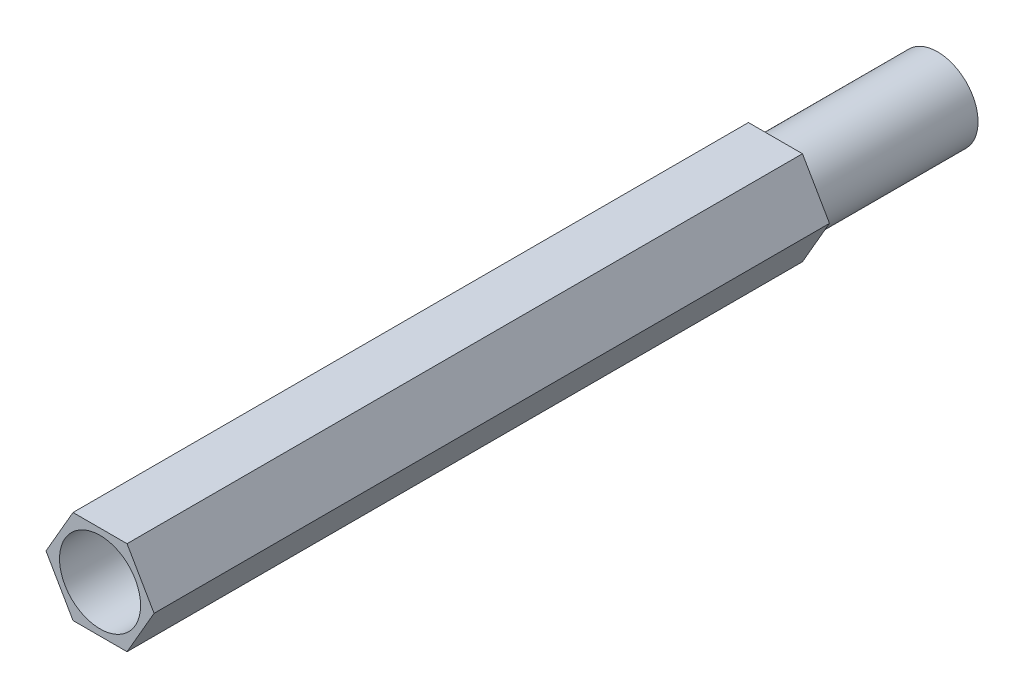
ISO-10303-21;
HEADER;
FILE_DESCRIPTION(('STEP AP214'),'2;1');
FILE_NAME('part.step','',(''),(''),'','','');
FILE_SCHEMA(('AUTOMOTIVE_DESIGN { 1 0 10303 214 1 1 1 1 }'));
ENDSEC;
DATA;
#1=APPLICATION_CONTEXT('core data for automotive mechanical design processes');
#2=APPLICATION_PROTOCOL_DEFINITION('international standard','automotive_design',2000,#1);
#3=PRODUCT_CONTEXT('',#1,'mechanical');
#4=PRODUCT('Part','Part','',(#3));
#5=PRODUCT_RELATED_PRODUCT_CATEGORY('part','',(#4));
#6=PRODUCT_DEFINITION_FORMATION('','',#4);
#7=PRODUCT_DEFINITION_CONTEXT('part definition',#1,'design');
#8=PRODUCT_DEFINITION('design','',#6,#7);
#9=PRODUCT_DEFINITION_SHAPE('','',#8);
#10=(LENGTH_UNIT() NAMED_UNIT(*) SI_UNIT(.MILLI.,.METRE.));
#11=(NAMED_UNIT(*) PLANE_ANGLE_UNIT() SI_UNIT($,.RADIAN.));
#12=(NAMED_UNIT(*) SI_UNIT($,.STERADIAN.) SOLID_ANGLE_UNIT());
#13=UNCERTAINTY_MEASURE_WITH_UNIT(LENGTH_MEASURE(1.E-05),#10,'distance_accuracy_value','');
#14=(GEOMETRIC_REPRESENTATION_CONTEXT(3) GLOBAL_UNCERTAINTY_ASSIGNED_CONTEXT((#13)) GLOBAL_UNIT_ASSIGNED_CONTEXT((#10,
#11,#12)) REPRESENTATION_CONTEXT('',''));
#15=CARTESIAN_POINT('',(0.,0.,0.));
#16=DIRECTION('',(0.,0.,1.));
#17=DIRECTION('',(1.,0.,0.));
#18=AXIS2_PLACEMENT_3D('',#15,#16,#17);
#19=CARTESIAN_POINT('',(0.999999999999947,-1.73205080756897,25.));
#20=DIRECTION('',(0.,-1.,0.));
#21=DIRECTION('',(0.,0.,-1.));
#22=AXIS2_PLACEMENT_3D('',#19,#20,#21);
#23=PLANE('',#22);
#24=DIRECTION('',(-1.,0.,0.));
#25=VECTOR('',#24,1.);
#26=CARTESIAN_POINT('',(0.999999999999947,-1.73205080756897,0.));
#27=LINE('',#26,#25);
#28=CARTESIAN_POINT('',(0.999999999999947,-1.73205080756897,0.));
#29=VERTEX_POINT('',#28);
#30=CARTESIAN_POINT('',(-1.00000000000005,-1.73205080756897,0.));
#31=VERTEX_POINT('',#30);
#32=EDGE_CURVE('E128',#29,#31,#27,.T.);
#33=ORIENTED_EDGE('',*,*,#32,.F.);
#34=DIRECTION('',(0.,0.,-1.));
#35=VECTOR('',#34,1.);
#36=CARTESIAN_POINT('',(0.999999999999947,-1.73205080756897,25.));
#37=LINE('',#36,#35);
#38=CARTESIAN_POINT('',(0.999999999999947,-1.73205080756897,25.));
#39=VERTEX_POINT('',#38);
#40=EDGE_CURVE('E50',#39,#29,#37,.T.);
#41=ORIENTED_EDGE('',*,*,#40,.F.);
#42=DIRECTION('',(-1.,0.,0.));
#43=VECTOR('',#42,1.);
#44=CARTESIAN_POINT('',(0.999999999999947,-1.73205080756897,25.));
#45=LINE('',#44,#43);
#46=CARTESIAN_POINT('',(-1.00000000000005,-1.73205080756897,25.));
#47=VERTEX_POINT('',#46);
#48=EDGE_CURVE('E144',#39,#47,#45,.T.);
#49=ORIENTED_EDGE('',*,*,#48,.T.);
#50=DIRECTION('',(0.,0.,-1.));
#51=VECTOR('',#50,1.);
#52=CARTESIAN_POINT('',(-1.00000000000005,-1.73205080756897,25.));
#53=LINE('',#52,#51);
#54=EDGE_CURVE('E44',#47,#31,#53,.T.);
#55=ORIENTED_EDGE('',*,*,#54,.T.);
#56=EDGE_LOOP('',(#33,#41,#49,#55));
#57=FACE_BOUND('',#56,.T.);
#58=ADVANCED_FACE('F41',(#57),#23,.T.);
#59=CARTESIAN_POINT('',(2.,0.,25.));
#60=DIRECTION('',(0.866025403784439,-0.5,0.));
#61=DIRECTION('',(0.5,0.866025403784439,0.));
#62=AXIS2_PLACEMENT_3D('',#59,#60,#61);
#63=PLANE('',#62);
#64=DIRECTION('',(-0.5,-0.866025403784439,0.));
#65=VECTOR('',#64,1.);
#66=CARTESIAN_POINT('',(2.,0.,0.));
#67=LINE('',#66,#65);
#68=CARTESIAN_POINT('',(2.,0.,0.));
#69=VERTEX_POINT('',#68);
#70=EDGE_CURVE('E141',#69,#29,#67,.T.);
#71=ORIENTED_EDGE('',*,*,#70,.F.);
#72=DIRECTION('',(0.,0.,-1.));
#73=VECTOR('',#72,1.);
#74=CARTESIAN_POINT('',(2.,0.,25.));
#75=LINE('',#74,#73);
#76=CARTESIAN_POINT('',(2.,0.,25.));
#77=VERTEX_POINT('',#76);
#78=EDGE_CURVE('E81',#77,#69,#75,.T.);
#79=ORIENTED_EDGE('',*,*,#78,.F.);
#80=DIRECTION('',(-0.5,-0.866025403784439,0.));
#81=VECTOR('',#80,1.);
#82=CARTESIAN_POINT('',(2.,0.,25.));
#83=LINE('',#82,#81);
#84=EDGE_CURVE('E118',#77,#39,#83,.T.);
#85=ORIENTED_EDGE('',*,*,#84,.T.);
#86=ORIENTED_EDGE('',*,*,#40,.T.);
#87=EDGE_LOOP('',(#71,#79,#85,#86));
#88=FACE_BOUND('',#87,.T.);
#89=ADVANCED_FACE('F152',(#88),#63,.T.);
#90=CARTESIAN_POINT('',(0.999999999999947,1.73205080756897,25.));
#91=DIRECTION('',(0.866025403784439,0.5,0.));
#92=DIRECTION('',(-0.5,0.866025403784439,0.));
#93=AXIS2_PLACEMENT_3D('',#90,#91,#92);
#94=PLANE('',#93);
#95=DIRECTION('',(0.5,-0.866025403784439,0.));
#96=VECTOR('',#95,1.);
#97=CARTESIAN_POINT('',(0.999999999999947,1.73205080756897,0.));
#98=LINE('',#97,#96);
#99=CARTESIAN_POINT('',(0.999999999999947,1.73205080756897,0.));
#100=VERTEX_POINT('',#99);
#101=EDGE_CURVE('E105',#100,#69,#98,.T.);
#102=ORIENTED_EDGE('',*,*,#101,.F.);
#103=DIRECTION('',(0.,0.,-1.));
#104=VECTOR('',#103,1.);
#105=CARTESIAN_POINT('',(0.999999999999947,1.73205080756897,25.));
#106=LINE('',#105,#104);
#107=CARTESIAN_POINT('',(0.999999999999947,1.73205080756897,25.));
#108=VERTEX_POINT('',#107);
#109=EDGE_CURVE('E100',#108,#100,#106,.T.);
#110=ORIENTED_EDGE('',*,*,#109,.F.);
#111=DIRECTION('',(0.5,-0.866025403784439,0.));
#112=VECTOR('',#111,1.);
#113=CARTESIAN_POINT('',(0.999999999999947,1.73205080756897,25.));
#114=LINE('',#113,#112);
#115=EDGE_CURVE('E103',#108,#77,#114,.T.);
#116=ORIENTED_EDGE('',*,*,#115,.T.);
#117=ORIENTED_EDGE('',*,*,#78,.T.);
#118=EDGE_LOOP('',(#102,#110,#116,#117));
#119=FACE_BOUND('',#118,.T.);
#120=ADVANCED_FACE('F102',(#119),#94,.T.);
#121=CARTESIAN_POINT('',(-1.00000000000005,1.73205080756897,25.));
#122=DIRECTION('',(0.,1.,0.));
#123=DIRECTION('',(0.,0.,1.));
#124=AXIS2_PLACEMENT_3D('',#121,#122,#123);
#125=PLANE('',#124);
#126=DIRECTION('',(1.,0.,0.));
#127=VECTOR('',#126,1.);
#128=CARTESIAN_POINT('',(-1.00000000000005,1.73205080756897,0.));
#129=LINE('',#128,#127);
#130=CARTESIAN_POINT('',(-1.00000000000005,1.73205080756897,0.));
#131=VERTEX_POINT('',#130);
#132=EDGE_CURVE('E138',#131,#100,#129,.T.);
#133=ORIENTED_EDGE('',*,*,#132,.F.);
#134=DIRECTION('',(0.,0.,-1.));
#135=VECTOR('',#134,1.);
#136=CARTESIAN_POINT('',(-1.00000000000005,1.73205080756897,25.));
#137=LINE('',#136,#135);
#138=CARTESIAN_POINT('',(-1.00000000000005,1.73205080756897,25.));
#139=VERTEX_POINT('',#138);
#140=EDGE_CURVE('E110',#139,#131,#137,.T.);
#141=ORIENTED_EDGE('',*,*,#140,.F.);
#142=DIRECTION('',(1.,0.,0.));
#143=VECTOR('',#142,1.);
#144=CARTESIAN_POINT('',(-1.00000000000005,1.73205080756897,25.));
#145=LINE('',#144,#143);
#146=EDGE_CURVE('E116',#139,#108,#145,.T.);
#147=ORIENTED_EDGE('',*,*,#146,.T.);
#148=ORIENTED_EDGE('',*,*,#109,.T.);
#149=EDGE_LOOP('',(#133,#141,#147,#148));
#150=FACE_BOUND('',#149,.T.);
#151=ADVANCED_FACE('F120',(#150),#125,.T.);
#152=CARTESIAN_POINT('',(-2.00000000000011,0.,25.));
#153=DIRECTION('',(-0.866025403784439,0.5,0.));
#154=DIRECTION('',(-0.5,-0.866025403784439,0.));
#155=AXIS2_PLACEMENT_3D('',#152,#153,#154);
#156=PLANE('',#155);
#157=DIRECTION('',(0.5,0.866025403784439,0.));
#158=VECTOR('',#157,1.);
#159=CARTESIAN_POINT('',(-2.00000000000011,0.,0.));
#160=LINE('',#159,#158);
#161=CARTESIAN_POINT('',(-2.00000000000011,0.,0.));
#162=VERTEX_POINT('',#161);
#163=EDGE_CURVE('E135',#162,#131,#160,.T.);
#164=ORIENTED_EDGE('',*,*,#163,.F.);
#165=DIRECTION('',(0.,0.,-1.));
#166=VECTOR('',#165,1.);
#167=CARTESIAN_POINT('',(-2.00000000000011,0.,25.));
#168=LINE('',#167,#166);
#169=CARTESIAN_POINT('',(-2.00000000000011,0.,25.));
#170=VERTEX_POINT('',#169);
#171=EDGE_CURVE('E147',#170,#162,#168,.T.);
#172=ORIENTED_EDGE('',*,*,#171,.F.);
#173=DIRECTION('',(0.5,0.866025403784439,0.));
#174=VECTOR('',#173,1.);
#175=CARTESIAN_POINT('',(-2.00000000000011,0.,25.));
#176=LINE('',#175,#174);
#177=EDGE_CURVE('E121',#170,#139,#176,.T.);
#178=ORIENTED_EDGE('',*,*,#177,.T.);
#179=ORIENTED_EDGE('',*,*,#140,.T.);
#180=EDGE_LOOP('',(#164,#172,#178,#179));
#181=FACE_BOUND('',#180,.T.);
#182=ADVANCED_FACE('F165',(#181),#156,.T.);
#183=CARTESIAN_POINT('',(-1.00000000000005,-1.73205080756897,25.));
#184=DIRECTION('',(-0.866025403784439,-0.5,0.));
#185=DIRECTION('',(0.5,-0.866025403784439,0.));
#186=AXIS2_PLACEMENT_3D('',#183,#184,#185);
#187=PLANE('',#186);
#188=DIRECTION('',(-0.5,0.866025403784439,0.));
#189=VECTOR('',#188,1.);
#190=CARTESIAN_POINT('',(-1.00000000000005,-1.73205080756897,0.));
#191=LINE('',#190,#189);
#192=EDGE_CURVE('E131',#31,#162,#191,.T.);
#193=ORIENTED_EDGE('',*,*,#192,.F.);
#194=ORIENTED_EDGE('',*,*,#54,.F.);
#195=DIRECTION('',(-0.5,0.866025403784439,0.));
#196=VECTOR('',#195,1.);
#197=CARTESIAN_POINT('',(-1.00000000000005,-1.73205080756897,25.));
#198=LINE('',#197,#196);
#199=EDGE_CURVE('E123',#47,#170,#198,.T.);
#200=ORIENTED_EDGE('',*,*,#199,.T.);
#201=ORIENTED_EDGE('',*,*,#171,.T.);
#202=EDGE_LOOP('',(#193,#194,#200,#201));
#203=FACE_BOUND('',#202,.T.);
#204=ADVANCED_FACE('F149',(#203),#187,.T.);
#205=CARTESIAN_POINT('',(0.,0.,25.));
#206=DIRECTION('',(0.,0.,-1.));
#207=DIRECTION('',(-1.,0.,0.));
#208=AXIS2_PLACEMENT_3D('',#205,#206,#207);
#209=PLANE('',#208);
#210=CARTESIAN_POINT('',(0.,0.,25.));
#211=DIRECTION('',(0.,0.,1.));
#212=DIRECTION('',(1.,0.,0.));
#213=AXIS2_PLACEMENT_3D('',#210,#211,#212);
#214=CIRCLE('',#213,1.49999999999999);
#215=CARTESIAN_POINT('',(1.49999999999999,0.,25.));
#216=VERTEX_POINT('',#215);
#217=EDGE_CURVE('E201',#216,#216,#214,.T.);
#218=ORIENTED_EDGE('',*,*,#217,.F.);
#219=EDGE_LOOP('',(#218));
#220=FACE_BOUND('',#219,.T.);
#221=ORIENTED_EDGE('',*,*,#48,.F.);
#222=ORIENTED_EDGE('',*,*,#84,.F.);
#223=ORIENTED_EDGE('',*,*,#115,.F.);
#224=ORIENTED_EDGE('',*,*,#146,.F.);
#225=ORIENTED_EDGE('',*,*,#177,.F.);
#226=ORIENTED_EDGE('',*,*,#199,.F.);
#227=EDGE_LOOP('',(#221,#222,#223,#224,#225,#226));
#228=FACE_BOUND('',#227,.T.);
#229=ADVANCED_FACE('F114',(#220,#228),#209,.F.);
#230=CARTESIAN_POINT('',(0.,0.,0.));
#231=DIRECTION('',(0.,0.,-1.));
#232=DIRECTION('',(-1.,0.,0.));
#233=AXIS2_PLACEMENT_3D('',#230,#231,#232);
#234=PLANE('',#233);
#235=CARTESIAN_POINT('',(0.,0.,0.));
#236=DIRECTION('',(0.,0.,-1.));
#237=DIRECTION('',(-1.,0.,0.));
#238=AXIS2_PLACEMENT_3D('',#235,#236,#237);
#239=CIRCLE('',#238,1.5);
#240=CARTESIAN_POINT('',(-1.5,0.,0.));
#241=VERTEX_POINT('',#240);
#242=EDGE_CURVE('E11',#241,#241,#239,.T.);
#243=ORIENTED_EDGE('',*,*,#242,.F.);
#244=EDGE_LOOP('',(#243));
#245=FACE_BOUND('',#244,.T.);
#246=ORIENTED_EDGE('',*,*,#32,.T.);
#247=ORIENTED_EDGE('',*,*,#192,.T.);
#248=ORIENTED_EDGE('',*,*,#163,.T.);
#249=ORIENTED_EDGE('',*,*,#132,.T.);
#250=ORIENTED_EDGE('',*,*,#101,.T.);
#251=ORIENTED_EDGE('',*,*,#70,.T.);
#252=EDGE_LOOP('',(#246,#247,#248,#249,#250,#251));
#253=FACE_BOUND('',#252,.T.);
#254=ADVANCED_FACE('F151',(#245,#253),#234,.T.);
#255=CARTESIAN_POINT('',(0.,0.,0.));
#256=DIRECTION('',(0.,0.,-1.));
#257=DIRECTION('',(-1.,0.,0.));
#258=AXIS2_PLACEMENT_3D('',#255,#256,#257);
#259=CYLINDRICAL_SURFACE('',#258,1.5);
#260=ORIENTED_EDGE('',*,*,#242,.T.);
#261=EDGE_LOOP('',(#260));
#262=FACE_BOUND('',#261,.T.);
#263=CARTESIAN_POINT('',(0.,0.,-6.));
#264=DIRECTION('',(0.,0.,-1.));
#265=DIRECTION('',(-1.,0.,0.));
#266=AXIS2_PLACEMENT_3D('',#263,#264,#265);
#267=CIRCLE('',#266,1.5);
#268=CARTESIAN_POINT('',(-1.5,0.,-6.));
#269=VERTEX_POINT('',#268);
#270=EDGE_CURVE('E132',#269,#269,#267,.T.);
#271=ORIENTED_EDGE('',*,*,#270,.F.);
#272=EDGE_LOOP('',(#271));
#273=FACE_BOUND('',#272,.T.);
#274=ADVANCED_FACE('F176',(#262,#273),#259,.T.);
#275=CARTESIAN_POINT('',(0.,0.,-6.));
#276=DIRECTION('',(0.,0.,-1.));
#277=DIRECTION('',(-1.,0.,0.));
#278=AXIS2_PLACEMENT_3D('',#275,#276,#277);
#279=PLANE('',#278);
#280=ORIENTED_EDGE('',*,*,#270,.T.);
#281=EDGE_LOOP('',(#280));
#282=FACE_BOUND('',#281,.T.);
#283=ADVANCED_FACE('F182',(#282),#279,.T.);
#284=CARTESIAN_POINT('',(0.,0.,20.));
#285=DIRECTION('',(0.,0.,-1.));
#286=DIRECTION('',(-1.,0.,0.));
#287=AXIS2_PLACEMENT_3D('',#284,#285,#286);
#288=PLANE('',#287);
#289=CARTESIAN_POINT('',(0.,0.,20.));
#290=DIRECTION('',(0.,0.,1.));
#291=DIRECTION('',(1.,0.,0.));
#292=AXIS2_PLACEMENT_3D('',#289,#290,#291);
#293=CIRCLE('',#292,1.49999999999999);
#294=CARTESIAN_POINT('',(1.49999999999999,0.,20.));
#295=VERTEX_POINT('',#294);
#296=EDGE_CURVE('E199',#295,#295,#293,.T.);
#297=ORIENTED_EDGE('',*,*,#296,.T.);
#298=EDGE_LOOP('',(#297));
#299=FACE_BOUND('',#298,.T.);
#300=ADVANCED_FACE('F186',(#299),#288,.F.);
#301=CARTESIAN_POINT('',(0.,0.,25.));
#302=DIRECTION('',(0.,0.,1.));
#303=DIRECTION('',(1.,0.,0.));
#304=AXIS2_PLACEMENT_3D('',#301,#302,#303);
#305=CYLINDRICAL_SURFACE('',#304,1.49999999999999);
#306=ORIENTED_EDGE('',*,*,#296,.F.);
#307=EDGE_LOOP('',(#306));
#308=FACE_BOUND('',#307,.T.);
#309=ORIENTED_EDGE('',*,*,#217,.T.);
#310=EDGE_LOOP('',(#309));
#311=FACE_BOUND('',#310,.T.);
#312=ADVANCED_FACE('F190',(#308,#311),#305,.F.);
#313=CLOSED_SHELL('',(#58,#89,#120,#151,#182,#204,#229,#254,#274,#283,#300,#312));
#314=MANIFOLD_SOLID_BREP('B2',#313);
#315=ADVANCED_BREP_SHAPE_REPRESENTATION('',(#18,#314),#14);
#316=SHAPE_DEFINITION_REPRESENTATION(#9,#315);
ENDSEC;
END-ISO-10303-21;
